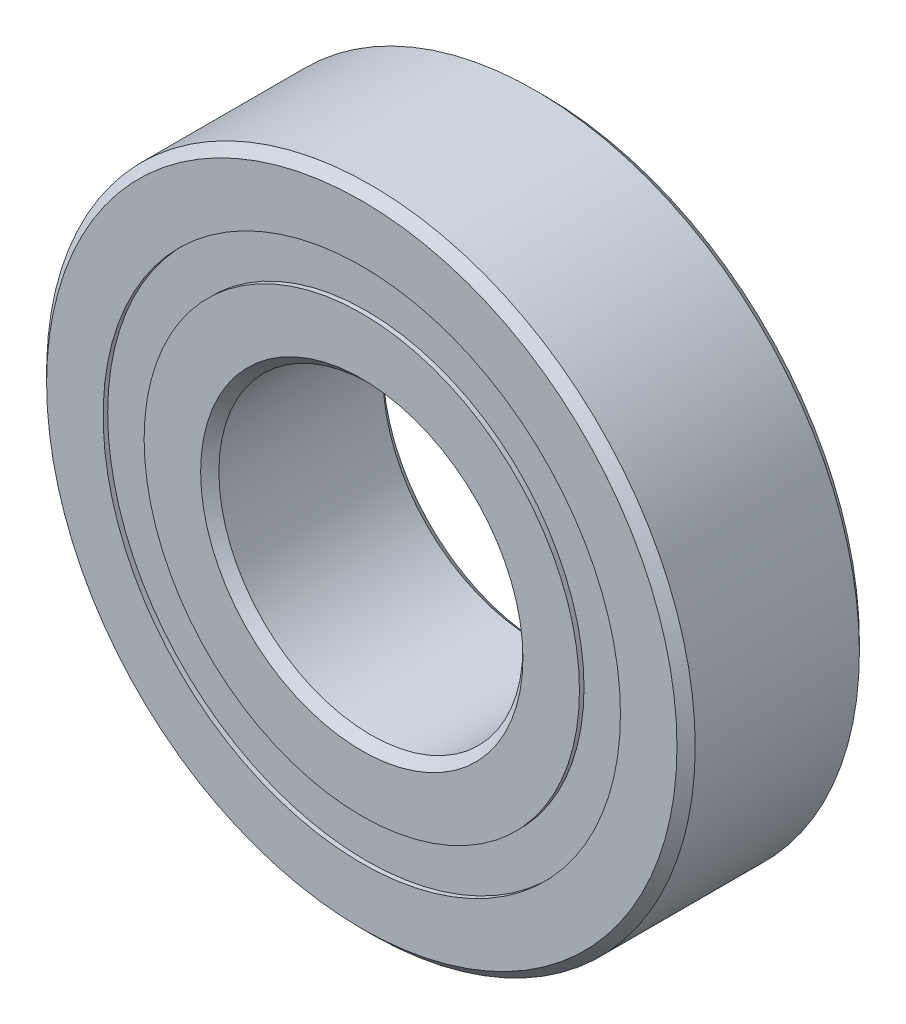
ISO-10303-21;
HEADER;
FILE_DESCRIPTION(('STEP AP214'),'2;1');
FILE_NAME('part.step','',(''),(''),'','','');
FILE_SCHEMA(('AUTOMOTIVE_DESIGN { 1 0 10303 214 1 1 1 1 }'));
ENDSEC;
DATA;
#1=APPLICATION_CONTEXT('core data for automotive mechanical design processes');
#2=APPLICATION_PROTOCOL_DEFINITION('international standard','automotive_design',2000,#1);
#3=PRODUCT_CONTEXT('',#1,'mechanical');
#4=PRODUCT('Part','Part','',(#3));
#5=PRODUCT_RELATED_PRODUCT_CATEGORY('part','',(#4));
#6=PRODUCT_DEFINITION_FORMATION('','',#4);
#7=PRODUCT_DEFINITION_CONTEXT('part definition',#1,'design');
#8=PRODUCT_DEFINITION('design','',#6,#7);
#9=PRODUCT_DEFINITION_SHAPE('','',#8);
#10=(LENGTH_UNIT() NAMED_UNIT(*) SI_UNIT(.MILLI.,.METRE.));
#11=(NAMED_UNIT(*) PLANE_ANGLE_UNIT() SI_UNIT($,.RADIAN.));
#12=(NAMED_UNIT(*) SI_UNIT($,.STERADIAN.) SOLID_ANGLE_UNIT());
#13=UNCERTAINTY_MEASURE_WITH_UNIT(LENGTH_MEASURE(1.E-05),#10,'distance_accuracy_value','');
#14=(GEOMETRIC_REPRESENTATION_CONTEXT(3) GLOBAL_UNCERTAINTY_ASSIGNED_CONTEXT((#13)) GLOBAL_UNIT_ASSIGNED_CONTEXT((#10,
#11,#12)) REPRESENTATION_CONTEXT('',''));
#15=CARTESIAN_POINT('',(0.,0.,0.));
#16=DIRECTION('',(0.,0.,1.));
#17=DIRECTION('',(1.,0.,0.));
#18=AXIS2_PLACEMENT_3D('',#15,#16,#17);
#19=CARTESIAN_POINT('',(-5.87499999999987,10.1757984944672,0.));
#20=DIRECTION('',(0.,0.,1.));
#21=DIRECTION('',(-0.499999999999989,0.866025403784445,0.));
#22=AXIS2_PLACEMENT_3D('',#19,#20,#21);
#23=SPHERICAL_SURFACE('',#22,2.2410039670515);
#24=CARTESIAN_POINT('',(-5.87499999999987,10.1757984944672,2.2410039670515));
#25=VERTEX_POINT('',#24);
#26=VERTEX_LOOP('',#25);
#27=FACE_BOUND('',#26,.T.);
#28=ADVANCED_FACE('F37',(#27),#23,.T.);
#29=CLOSED_SHELL('',(#28));
#30=MANIFOLD_SOLID_BREP('B2',#29);
#31=CARTESIAN_POINT('',(-10.1757984944671,5.87500000000012,0.));
#32=DIRECTION('',(0.,0.,1.));
#33=DIRECTION('',(-0.866025403784433,0.50000000000001,0.));
#34=AXIS2_PLACEMENT_3D('',#31,#32,#33);
#35=SPHERICAL_SURFACE('',#34,2.2410039670515);
#36=CARTESIAN_POINT('',(-10.1757984944671,5.87500000000012,2.2410039670515));
#37=VERTEX_POINT('',#36);
#38=VERTEX_LOOP('',#37);
#39=FACE_BOUND('',#38,.T.);
#40=ADVANCED_FACE('F57',(#39),#35,.T.);
#41=CLOSED_SHELL('',(#40));
#42=MANIFOLD_SOLID_BREP('B6',#41);
#43=CARTESIAN_POINT('',(-11.75,1.2307471719422E-13,0.));
#44=DIRECTION('',(0.,0.,1.));
#45=DIRECTION('',(-1.,0.,0.));
#46=AXIS2_PLACEMENT_3D('',#43,#44,#45);
#47=SPHERICAL_SURFACE('',#46,2.2410039670515);
#48=CARTESIAN_POINT('',(-11.75,1.2307471719422E-13,2.2410039670515));
#49=VERTEX_POINT('',#48);
#50=VERTEX_LOOP('',#49);
#51=FACE_BOUND('',#50,.T.);
#52=ADVANCED_FACE('F77',(#51),#47,.T.);
#53=CLOSED_SHELL('',(#52));
#54=MANIFOLD_SOLID_BREP('B33',#53);
#55=CARTESIAN_POINT('',(-10.1757984944672,-5.87499999999991,0.));
#56=DIRECTION('',(0.,0.,1.));
#57=DIRECTION('',(-0.866025403784443,-0.499999999999992,0.));
#58=AXIS2_PLACEMENT_3D('',#55,#56,#57);
#59=SPHERICAL_SURFACE('',#58,2.2410039670515);
#60=CARTESIAN_POINT('',(-10.1757984944672,-5.87499999999991,2.2410039670515));
#61=VERTEX_POINT('',#60);
#62=VERTEX_LOOP('',#61);
#63=FACE_BOUND('',#62,.T.);
#64=ADVANCED_FACE('F97',(#63),#59,.T.);
#65=CLOSED_SHELL('',(#64));
#66=MANIFOLD_SOLID_BREP('B53',#65);
#67=CARTESIAN_POINT('',(-5.87500000000009,-10.1757984944671,0.));
#68=DIRECTION('',(0.,0.,1.));
#69=DIRECTION('',(-0.500000000000007,-0.866025403784435,0.));
#70=AXIS2_PLACEMENT_3D('',#67,#68,#69);
#71=SPHERICAL_SURFACE('',#70,2.2410039670515);
#72=CARTESIAN_POINT('',(-5.87500000000009,-10.1757984944671,2.2410039670515));
#73=VERTEX_POINT('',#72);
#74=VERTEX_LOOP('',#73);
#75=FACE_BOUND('',#74,.T.);
#76=ADVANCED_FACE('F117',(#75),#71,.T.);
#77=CLOSED_SHELL('',(#76));
#78=MANIFOLD_SOLID_BREP('B73',#77);
#79=CARTESIAN_POINT('',(0.,-11.75,0.));
#80=DIRECTION('',(0.,0.,1.));
#81=DIRECTION('',(0.,-1.,0.));
#82=AXIS2_PLACEMENT_3D('',#79,#80,#81);
#83=SPHERICAL_SURFACE('',#82,2.2410039670515);
#84=CARTESIAN_POINT('',(0.,-11.75,2.2410039670515));
#85=VERTEX_POINT('',#84);
#86=VERTEX_LOOP('',#85);
#87=FACE_BOUND('',#86,.T.);
#88=ADVANCED_FACE('F137',(#87),#83,.T.);
#89=CLOSED_SHELL('',(#88));
#90=MANIFOLD_SOLID_BREP('B93',#89);
#91=CARTESIAN_POINT('',(5.87499999999994,-10.1757984944672,0.));
#92=DIRECTION('',(0.,0.,1.));
#93=DIRECTION('',(0.499999999999995,-0.866025403784442,0.));
#94=AXIS2_PLACEMENT_3D('',#91,#92,#93);
#95=SPHERICAL_SURFACE('',#94,2.2410039670515);
#96=CARTESIAN_POINT('',(5.87499999999994,-10.1757984944672,2.2410039670515));
#97=VERTEX_POINT('',#96);
#98=VERTEX_LOOP('',#97);
#99=FACE_BOUND('',#98,.T.);
#100=ADVANCED_FACE('F157',(#99),#95,.T.);
#101=CLOSED_SHELL('',(#100));
#102=MANIFOLD_SOLID_BREP('B113',#101);
#103=CARTESIAN_POINT('',(10.1757984944671,-5.87500000000005,0.));
#104=DIRECTION('',(0.,0.,1.));
#105=DIRECTION('',(0.866025403784436,-0.500000000000004,0.));
#106=AXIS2_PLACEMENT_3D('',#103,#104,#105);
#107=SPHERICAL_SURFACE('',#106,2.2410039670515);
#108=CARTESIAN_POINT('',(10.1757984944671,-5.87500000000005,2.2410039670515));
#109=VERTEX_POINT('',#108);
#110=VERTEX_LOOP('',#109);
#111=FACE_BOUND('',#110,.T.);
#112=ADVANCED_FACE('F177',(#111),#107,.T.);
#113=CLOSED_SHELL('',(#112));
#114=MANIFOLD_SOLID_BREP('B133',#113);
#115=CARTESIAN_POINT('',(11.75,0.,0.));
#116=DIRECTION('',(0.,0.,1.));
#117=DIRECTION('',(1.,0.,0.));
#118=AXIS2_PLACEMENT_3D('',#115,#116,#117);
#119=SPHERICAL_SURFACE('',#118,2.2410039670515);
#120=CARTESIAN_POINT('',(11.75,0.,2.2410039670515));
#121=VERTEX_POINT('',#120);
#122=VERTEX_LOOP('',#121);
#123=FACE_BOUND('',#122,.T.);
#124=ADVANCED_FACE('F197',(#123),#119,.T.);
#125=CLOSED_SHELL('',(#124));
#126=MANIFOLD_SOLID_BREP('B153',#125);
#127=CARTESIAN_POINT('',(10.1757984944672,5.87499999999998,0.));
#128=DIRECTION('',(0.,0.,1.));
#129=DIRECTION('',(0.86602540378444,0.499999999999998,0.));
#130=AXIS2_PLACEMENT_3D('',#127,#128,#129);
#131=SPHERICAL_SURFACE('',#130,2.2410039670515);
#132=CARTESIAN_POINT('',(10.1757984944672,5.87499999999998,2.2410039670515));
#133=VERTEX_POINT('',#132);
#134=VERTEX_LOOP('',#133);
#135=FACE_BOUND('',#134,.T.);
#136=ADVANCED_FACE('F217',(#135),#131,.T.);
#137=CLOSED_SHELL('',(#136));
#138=MANIFOLD_SOLID_BREP('B173',#137);
#139=CARTESIAN_POINT('',(5.87500000000001,10.1757984944671,0.));
#140=DIRECTION('',(0.,0.,1.));
#141=DIRECTION('',(0.500000000000001,0.866025403784438,0.));
#142=AXIS2_PLACEMENT_3D('',#139,#140,#141);
#143=SPHERICAL_SURFACE('',#142,2.2410039670515);
#144=CARTESIAN_POINT('',(5.87500000000001,10.1757984944671,2.2410039670515));
#145=VERTEX_POINT('',#144);
#146=VERTEX_LOOP('',#145);
#147=FACE_BOUND('',#146,.T.);
#148=ADVANCED_FACE('F237',(#147),#143,.T.);
#149=CLOSED_SHELL('',(#148));
#150=MANIFOLD_SOLID_BREP('B193',#149);
#151=CARTESIAN_POINT('',(0.,11.75,0.));
#152=DIRECTION('',(0.,0.,1.));
#153=DIRECTION('',(0.,1.,0.));
#154=AXIS2_PLACEMENT_3D('',#151,#152,#153);
#155=SPHERICAL_SURFACE('',#154,2.2410039670515);
#156=CARTESIAN_POINT('',(0.,11.75,2.2410039670515));
#157=VERTEX_POINT('',#156);
#158=VERTEX_LOOP('',#157);
#159=FACE_BOUND('',#158,.T.);
#160=ADVANCED_FACE('F258',(#159),#155,.T.);
#161=CLOSED_SHELL('',(#160));
#162=MANIFOLD_SOLID_BREP('B213',#161);
#163=CARTESIAN_POINT('',(0.,0.,4.5));
#164=DIRECTION('',(0.,0.,1.));
#165=DIRECTION('',(1.,0.,0.));
#166=AXIS2_PLACEMENT_3D('',#163,#164,#165);
#167=CYLINDRICAL_SURFACE('',#166,12.760989010989);
#168=CARTESIAN_POINT('',(0.,0.,-4.5));
#169=DIRECTION('',(0.,0.,1.));
#170=DIRECTION('',(1.,0.,0.));
#171=AXIS2_PLACEMENT_3D('',#168,#169,#170);
#172=CIRCLE('',#171,12.760989010989);
#173=CARTESIAN_POINT('',(12.760989010989,0.,-4.5));
#174=VERTEX_POINT('',#173);
#175=EDGE_CURVE('E310',#174,#174,#172,.T.);
#176=ORIENTED_EDGE('',*,*,#175,.F.);
#177=EDGE_LOOP('',(#176));
#178=FACE_BOUND('',#177,.T.);
#179=CARTESIAN_POINT('',(0.,0.,-4.275));
#180=DIRECTION('',(0.,0.,1.));
#181=DIRECTION('',(1.,0.,0.));
#182=AXIS2_PLACEMENT_3D('',#179,#180,#181);
#183=CIRCLE('',#182,12.760989010989);
#184=CARTESIAN_POINT('',(12.760989010989,0.,-4.275));
#185=VERTEX_POINT('',#184);
#186=EDGE_CURVE('E257',#185,#185,#183,.F.);
#187=ORIENTED_EDGE('',*,*,#186,.F.);
#188=EDGE_LOOP('',(#187));
#189=FACE_BOUND('',#188,.T.);
#190=ADVANCED_FACE('F271',(#178,#189),#167,.F.);
#191=CARTESIAN_POINT('',(0.,0.,4.5));
#192=DIRECTION('',(0.,0.,1.));
#193=DIRECTION('',(1.,0.,0.));
#194=AXIS2_PLACEMENT_3D('',#191,#192,#193);
#195=CYLINDRICAL_SURFACE('',#194,10.739010989011);
#196=CARTESIAN_POINT('',(0.,0.,-4.5));
#197=DIRECTION('',(0.,0.,1.));
#198=DIRECTION('',(1.,0.,0.));
#199=AXIS2_PLACEMENT_3D('',#196,#197,#198);
#200=CIRCLE('',#199,10.739010989011);
#201=CARTESIAN_POINT('',(10.739010989011,0.,-4.5));
#202=VERTEX_POINT('',#201);
#203=EDGE_CURVE('E337',#202,#202,#200,.T.);
#204=ORIENTED_EDGE('',*,*,#203,.T.);
#205=EDGE_LOOP('',(#204));
#206=FACE_BOUND('',#205,.T.);
#207=CARTESIAN_POINT('',(0.,0.,-4.275));
#208=DIRECTION('',(0.,0.,1.));
#209=DIRECTION('',(1.,0.,0.));
#210=AXIS2_PLACEMENT_3D('',#207,#208,#209);
#211=CIRCLE('',#210,10.739010989011);
#212=CARTESIAN_POINT('',(10.739010989011,0.,-4.275));
#213=VERTEX_POINT('',#212);
#214=EDGE_CURVE('E283',#213,#213,#211,.T.);
#215=ORIENTED_EDGE('',*,*,#214,.F.);
#216=EDGE_LOOP('',(#215));
#217=FACE_BOUND('',#216,.T.);
#218=ADVANCED_FACE('F379',(#206,#217),#195,.T.);
#219=CARTESIAN_POINT('',(0.,0.,4.5));
#220=DIRECTION('',(0.,0.,1.));
#221=DIRECTION('',(1.,0.,0.));
#222=AXIS2_PLACEMENT_3D('',#219,#220,#221);
#223=CYLINDRICAL_SURFACE('',#222,12.760989010989);
#224=CARTESIAN_POINT('',(0.,0.,4.5));
#225=DIRECTION('',(0.,0.,1.));
#226=DIRECTION('',(1.,0.,0.));
#227=AXIS2_PLACEMENT_3D('',#224,#225,#226);
#228=CIRCLE('',#227,12.760989010989);
#229=CARTESIAN_POINT('',(12.760989010989,0.,4.5));
#230=VERTEX_POINT('',#229);
#231=EDGE_CURVE('E301',#230,#230,#228,.T.);
#232=ORIENTED_EDGE('',*,*,#231,.T.);
#233=EDGE_LOOP('',(#232));
#234=FACE_BOUND('',#233,.T.);
#235=CARTESIAN_POINT('',(0.,0.,4.275));
#236=DIRECTION('',(0.,0.,-1.));
#237=DIRECTION('',(-1.,0.,0.));
#238=AXIS2_PLACEMENT_3D('',#235,#236,#237);
#239=CIRCLE('',#238,12.760989010989);
#240=CARTESIAN_POINT('',(-12.760989010989,0.,4.275));
#241=VERTEX_POINT('',#240);
#242=EDGE_CURVE('E292',#241,#241,#239,.F.);
#243=ORIENTED_EDGE('',*,*,#242,.F.);
#244=EDGE_LOOP('',(#243));
#245=FACE_BOUND('',#244,.T.);
#246=ADVANCED_FACE('F377',(#234,#245),#223,.F.);
#247=CARTESIAN_POINT('',(0.,0.,4.05));
#248=DIRECTION('',(0.,0.,-1.));
#249=DIRECTION('',(-1.,0.,0.));
#250=AXIS2_PLACEMENT_3D('',#247,#248,#249);
#251=CONICAL_SURFACE('',#250,16.,0.785398163397451);
#252=CARTESIAN_POINT('',(0.,0.,4.5));
#253=DIRECTION('',(0.,0.,1.));
#254=DIRECTION('',(1.,0.,0.));
#255=AXIS2_PLACEMENT_3D('',#252,#253,#254);
#256=CIRCLE('',#255,15.55);
#257=CARTESIAN_POINT('',(15.55,0.,4.5));
#258=VERTEX_POINT('',#257);
#259=EDGE_CURVE('E298',#258,#258,#256,.T.);
#260=ORIENTED_EDGE('',*,*,#259,.F.);
#261=EDGE_LOOP('',(#260));
#262=FACE_BOUND('',#261,.T.);
#263=CARTESIAN_POINT('',(0.,0.,4.05));
#264=DIRECTION('',(0.,0.,1.));
#265=DIRECTION('',(1.,0.,0.));
#266=AXIS2_PLACEMENT_3D('',#263,#264,#265);
#267=CIRCLE('',#266,16.);
#268=CARTESIAN_POINT('',(16.,0.,4.05));
#269=VERTEX_POINT('',#268);
#270=EDGE_CURVE('E319',#269,#269,#267,.T.);
#271=ORIENTED_EDGE('',*,*,#270,.T.);
#272=EDGE_LOOP('',(#271));
#273=FACE_BOUND('',#272,.T.);
#274=ADVANCED_FACE('F273',(#262,#273),#251,.T.);
#275=CARTESIAN_POINT('',(0.,15.55,4.5));
#276=DIRECTION('',(0.,0.,-1.));
#277=DIRECTION('',(-1.,0.,0.));
#278=AXIS2_PLACEMENT_3D('',#275,#276,#277);
#279=PLANE('',#278);
#280=ORIENTED_EDGE('',*,*,#231,.F.);
#281=EDGE_LOOP('',(#280));
#282=FACE_BOUND('',#281,.T.);
#283=ORIENTED_EDGE('',*,*,#259,.T.);
#284=EDGE_LOOP('',(#283));
#285=FACE_BOUND('',#284,.T.);
#286=ADVANCED_FACE('F387',(#282,#285),#279,.F.);
#287=CARTESIAN_POINT('',(0.,15.55,-4.5));
#288=DIRECTION('',(0.,0.,1.));
#289=DIRECTION('',(1.,0.,0.));
#290=AXIS2_PLACEMENT_3D('',#287,#288,#289);
#291=PLANE('',#290);
#292=CARTESIAN_POINT('',(0.,0.,-4.5));
#293=DIRECTION('',(0.,0.,1.));
#294=DIRECTION('',(1.,0.,0.));
#295=AXIS2_PLACEMENT_3D('',#292,#293,#294);
#296=CIRCLE('',#295,15.55);
#297=CARTESIAN_POINT('',(15.55,0.,-4.5));
#298=VERTEX_POINT('',#297);
#299=EDGE_CURVE('E313',#298,#298,#296,.T.);
#300=ORIENTED_EDGE('',*,*,#299,.F.);
#301=EDGE_LOOP('',(#300));
#302=FACE_BOUND('',#301,.T.);
#303=ORIENTED_EDGE('',*,*,#175,.T.);
#304=EDGE_LOOP('',(#303));
#305=FACE_BOUND('',#304,.T.);
#306=ADVANCED_FACE('F449',(#302,#305),#291,.F.);
#307=CARTESIAN_POINT('',(0.,0.,-4.5));
#308=DIRECTION('',(0.,0.,1.));
#309=DIRECTION('',(1.,0.,0.));
#310=AXIS2_PLACEMENT_3D('',#307,#308,#309);
#311=CONICAL_SURFACE('',#310,15.55,0.785398163397452);
#312=CARTESIAN_POINT('',(0.,0.,-4.05));
#313=DIRECTION('',(0.,0.,1.));
#314=DIRECTION('',(1.,0.,0.));
#315=AXIS2_PLACEMENT_3D('',#312,#313,#314);
#316=CIRCLE('',#315,16.);
#317=CARTESIAN_POINT('',(16.,0.,-4.05));
#318=VERTEX_POINT('',#317);
#319=EDGE_CURVE('E316',#318,#318,#316,.T.);
#320=ORIENTED_EDGE('',*,*,#319,.F.);
#321=EDGE_LOOP('',(#320));
#322=FACE_BOUND('',#321,.T.);
#323=ORIENTED_EDGE('',*,*,#299,.T.);
#324=EDGE_LOOP('',(#323));
#325=FACE_BOUND('',#324,.T.);
#326=ADVANCED_FACE('F446',(#322,#325),#311,.T.);
#327=CARTESIAN_POINT('',(0.,0.,4.5));
#328=DIRECTION('',(0.,0.,1.));
#329=DIRECTION('',(1.,0.,0.));
#330=AXIS2_PLACEMENT_3D('',#327,#328,#329);
#331=CYLINDRICAL_SURFACE('',#330,16.);
#332=ORIENTED_EDGE('',*,*,#270,.F.);
#333=EDGE_LOOP('',(#332));
#334=FACE_BOUND('',#333,.T.);
#335=ORIENTED_EDGE('',*,*,#319,.T.);
#336=EDGE_LOOP('',(#335));
#337=FACE_BOUND('',#336,.T.);
#338=ADVANCED_FACE('F373',(#334,#337),#331,.T.);
#339=CARTESIAN_POINT('',(0.,12.760989010989,4.275));
#340=DIRECTION('',(0.,0.,-1.));
#341=DIRECTION('',(-1.,0.,0.));
#342=AXIS2_PLACEMENT_3D('',#339,#340,#341);
#343=PLANE('',#342);
#344=CARTESIAN_POINT('',(0.,0.,4.275));
#345=DIRECTION('',(0.,0.,1.));
#346=DIRECTION('',(1.,0.,0.));
#347=AXIS2_PLACEMENT_3D('',#344,#345,#346);
#348=CIRCLE('',#347,10.739010989011);
#349=CARTESIAN_POINT('',(10.739010989011,0.,4.275));
#350=VERTEX_POINT('',#349);
#351=EDGE_CURVE('E322',#350,#350,#348,.T.);
#352=ORIENTED_EDGE('',*,*,#351,.F.);
#353=EDGE_LOOP('',(#352));
#354=FACE_BOUND('',#353,.T.);
#355=ORIENTED_EDGE('',*,*,#242,.T.);
#356=EDGE_LOOP('',(#355));
#357=FACE_BOUND('',#356,.T.);
#358=ADVANCED_FACE('F366',(#354,#357),#343,.F.);
#359=CARTESIAN_POINT('',(0.,0.,4.5));
#360=DIRECTION('',(0.,0.,1.));
#361=DIRECTION('',(1.,0.,0.));
#362=AXIS2_PLACEMENT_3D('',#359,#360,#361);
#363=CYLINDRICAL_SURFACE('',#362,10.739010989011);
#364=CARTESIAN_POINT('',(0.,0.,4.5));
#365=DIRECTION('',(0.,0.,1.));
#366=DIRECTION('',(1.,0.,0.));
#367=AXIS2_PLACEMENT_3D('',#364,#365,#366);
#368=CIRCLE('',#367,10.739010989011);
#369=CARTESIAN_POINT('',(10.739010989011,0.,4.5));
#370=VERTEX_POINT('',#369);
#371=EDGE_CURVE('E346',#370,#370,#368,.T.);
#372=ORIENTED_EDGE('',*,*,#371,.F.);
#373=EDGE_LOOP('',(#372));
#374=FACE_BOUND('',#373,.T.);
#375=ORIENTED_EDGE('',*,*,#351,.T.);
#376=EDGE_LOOP('',(#375));
#377=FACE_BOUND('',#376,.T.);
#378=ADVANCED_FACE('F363',(#374,#377),#363,.T.);
#379=CARTESIAN_POINT('',(0.,0.,4.5));
#380=DIRECTION('',(0.,0.,1.));
#381=DIRECTION('',(1.,0.,0.));
#382=AXIS2_PLACEMENT_3D('',#379,#380,#381);
#383=CONICAL_SURFACE('',#382,7.95000000000001,0.785398163397455);
#384=CARTESIAN_POINT('',(0.,0.,4.05));
#385=DIRECTION('',(0.,0.,1.));
#386=DIRECTION('',(1.,0.,0.));
#387=AXIS2_PLACEMENT_3D('',#384,#385,#386);
#388=CIRCLE('',#387,7.50000000000001);
#389=CARTESIAN_POINT('',(7.50000000000001,0.,4.05));
#390=VERTEX_POINT('',#389);
#391=EDGE_CURVE('E328',#390,#390,#388,.T.);
#392=ORIENTED_EDGE('',*,*,#391,.F.);
#393=EDGE_LOOP('',(#392));
#394=FACE_BOUND('',#393,.T.);
#395=CARTESIAN_POINT('',(0.,0.,4.5));
#396=DIRECTION('',(0.,0.,1.));
#397=DIRECTION('',(1.,0.,0.));
#398=AXIS2_PLACEMENT_3D('',#395,#396,#397);
#399=CIRCLE('',#398,7.95000000000001);
#400=CARTESIAN_POINT('',(7.95000000000001,0.,4.5));
#401=VERTEX_POINT('',#400);
#402=EDGE_CURVE('E349',#401,#401,#399,.T.);
#403=ORIENTED_EDGE('',*,*,#402,.T.);
#404=EDGE_LOOP('',(#403));
#405=FACE_BOUND('',#404,.T.);
#406=ADVANCED_FACE('F353',(#394,#405),#383,.F.);
#407=CARTESIAN_POINT('',(0.,0.,4.5));
#408=DIRECTION('',(0.,0.,1.));
#409=DIRECTION('',(1.,0.,0.));
#410=AXIS2_PLACEMENT_3D('',#407,#408,#409);
#411=CYLINDRICAL_SURFACE('',#410,7.50000000000001);
#412=CARTESIAN_POINT('',(0.,0.,-4.05));
#413=DIRECTION('',(0.,0.,1.));
#414=DIRECTION('',(1.,0.,0.));
#415=AXIS2_PLACEMENT_3D('',#412,#413,#414);
#416=CIRCLE('',#415,7.50000000000001);
#417=CARTESIAN_POINT('',(7.50000000000001,0.,-4.05));
#418=VERTEX_POINT('',#417);
#419=EDGE_CURVE('E331',#418,#418,#416,.T.);
#420=ORIENTED_EDGE('',*,*,#419,.F.);
#421=EDGE_LOOP('',(#420));
#422=FACE_BOUND('',#421,.T.);
#423=ORIENTED_EDGE('',*,*,#391,.T.);
#424=EDGE_LOOP('',(#423));
#425=FACE_BOUND('',#424,.T.);
#426=ADVANCED_FACE('F436',(#422,#425),#411,.F.);
#427=CARTESIAN_POINT('',(0.,0.,-4.05));
#428=DIRECTION('',(0.,0.,-1.));
#429=DIRECTION('',(-1.,0.,0.));
#430=AXIS2_PLACEMENT_3D('',#427,#428,#429);
#431=CONICAL_SURFACE('',#430,7.50000000000001,0.785398163397456);
#432=CARTESIAN_POINT('',(0.,0.,-4.5));
#433=DIRECTION('',(0.,0.,1.));
#434=DIRECTION('',(1.,0.,0.));
#435=AXIS2_PLACEMENT_3D('',#432,#433,#434);
#436=CIRCLE('',#435,7.95000000000001);
#437=CARTESIAN_POINT('',(7.95000000000001,0.,-4.5));
#438=VERTEX_POINT('',#437);
#439=EDGE_CURVE('E334',#438,#438,#436,.T.);
#440=ORIENTED_EDGE('',*,*,#439,.F.);
#441=EDGE_LOOP('',(#440));
#442=FACE_BOUND('',#441,.T.);
#443=ORIENTED_EDGE('',*,*,#419,.T.);
#444=EDGE_LOOP('',(#443));
#445=FACE_BOUND('',#444,.T.);
#446=ADVANCED_FACE('F432',(#442,#445),#431,.F.);
#447=CARTESIAN_POINT('',(0.,7.95000000000001,-4.5));
#448=DIRECTION('',(0.,0.,1.));
#449=DIRECTION('',(1.,0.,0.));
#450=AXIS2_PLACEMENT_3D('',#447,#448,#449);
#451=PLANE('',#450);
#452=ORIENTED_EDGE('',*,*,#203,.F.);
#453=EDGE_LOOP('',(#452));
#454=FACE_BOUND('',#453,.T.);
#455=ORIENTED_EDGE('',*,*,#439,.T.);
#456=EDGE_LOOP('',(#455));
#457=FACE_BOUND('',#456,.T.);
#458=ADVANCED_FACE('F359',(#454,#457),#451,.F.);
#459=CARTESIAN_POINT('',(0.,7.95000000000001,4.5));
#460=DIRECTION('',(0.,0.,-1.));
#461=DIRECTION('',(-1.,0.,0.));
#462=AXIS2_PLACEMENT_3D('',#459,#460,#461);
#463=PLANE('',#462);
#464=ORIENTED_EDGE('',*,*,#402,.F.);
#465=EDGE_LOOP('',(#464));
#466=FACE_BOUND('',#465,.T.);
#467=ORIENTED_EDGE('',*,*,#371,.T.);
#468=EDGE_LOOP('',(#467));
#469=FACE_BOUND('',#468,.T.);
#470=ADVANCED_FACE('F355',(#466,#469),#463,.F.);
#471=CARTESIAN_POINT('',(0.,12.760989010989,-4.275));
#472=DIRECTION('',(0.,0.,1.));
#473=DIRECTION('',(1.,0.,0.));
#474=AXIS2_PLACEMENT_3D('',#471,#472,#473);
#475=PLANE('',#474);
#476=ORIENTED_EDGE('',*,*,#186,.T.);
#477=EDGE_LOOP('',(#476));
#478=FACE_BOUND('',#477,.T.);
#479=ORIENTED_EDGE('',*,*,#214,.T.);
#480=EDGE_LOOP('',(#479));
#481=FACE_BOUND('',#480,.T.);
#482=ADVANCED_FACE('F358',(#478,#481),#475,.F.);
#483=CLOSED_SHELL('',(#190,#218,#246,#274,#286,#306,#326,#338,#358,#378,#406,#426,#446,#458,
#470,#482));
#484=CARTESIAN_POINT('',(0.,12.760989010989,-2.2410039670515));
#485=DIRECTION('',(0.,0.,-1.));
#486=DIRECTION('',(-1.,0.,0.));
#487=AXIS2_PLACEMENT_3D('',#484,#485,#486);
#488=PLANE('',#487);
#489=CARTESIAN_POINT('',(0.,0.,-2.2410039670515));
#490=DIRECTION('',(0.,0.,-1.));
#491=DIRECTION('',(-1.,0.,0.));
#492=AXIS2_PLACEMENT_3D('',#489,#490,#491);
#493=CIRCLE('',#492,10.739010989011);
#494=CARTESIAN_POINT('',(-10.739010989011,0.,-2.2410039670515));
#495=VERTEX_POINT('',#494);
#496=EDGE_CURVE('E287',#495,#495,#493,.T.);
#497=ORIENTED_EDGE('',*,*,#496,.T.);
#498=EDGE_LOOP('',(#497));
#499=FACE_BOUND('',#498,.T.);
#500=CARTESIAN_POINT('',(0.,0.,-2.2410039670515));
#501=DIRECTION('',(0.,0.,-1.));
#502=DIRECTION('',(-1.,0.,0.));
#503=AXIS2_PLACEMENT_3D('',#500,#501,#502);
#504=CIRCLE('',#503,12.760989010989);
#505=CARTESIAN_POINT('',(-12.760989010989,0.,-2.2410039670515));
#506=VERTEX_POINT('',#505);
#507=EDGE_CURVE('E279',#506,#506,#504,.F.);
#508=ORIENTED_EDGE('',*,*,#507,.T.);
#509=EDGE_LOOP('',(#508));
#510=FACE_BOUND('',#509,.T.);
#511=ADVANCED_FACE('F395',(#499,#510),#488,.F.);
#512=CARTESIAN_POINT('',(0.,0.,2.));
#513=DIRECTION('',(0.,0.,1.));
#514=DIRECTION('',(1.,0.,0.));
#515=AXIS2_PLACEMENT_3D('',#512,#513,#514);
#516=CIRCLE('',#515,12.760989010989);
#517=CARTESIAN_POINT('',(12.760989010989,0.,2.));
#518=VERTEX_POINT('',#517);
#519=EDGE_CURVE('E304',#518,#518,#516,.T.);
#520=ORIENTED_EDGE('',*,*,#519,.F.);
#521=EDGE_LOOP('',(#520));
#522=FACE_BOUND('',#521,.T.);
#523=CARTESIAN_POINT('',(0.,0.,2.2410039670515));
#524=DIRECTION('',(0.,0.,1.));
#525=DIRECTION('',(1.,0.,0.));
#526=AXIS2_PLACEMENT_3D('',#523,#524,#525);
#527=CIRCLE('',#526,12.760989010989);
#528=CARTESIAN_POINT('',(12.760989010989,0.,2.2410039670515));
#529=VERTEX_POINT('',#528);
#530=EDGE_CURVE('E295',#529,#529,#527,.F.);
#531=ORIENTED_EDGE('',*,*,#530,.F.);
#532=EDGE_LOOP('',(#531));
#533=FACE_BOUND('',#532,.T.);
#534=ADVANCED_FACE('F382',(#522,#533),#223,.F.);
#535=CARTESIAN_POINT('',(0.,0.,0.));
#536=DIRECTION('',(0.,0.,1.));
#537=DIRECTION('',(1.,0.,0.));
#538=AXIS2_PLACEMENT_3D('',#535,#536,#537);
#539=TOROIDAL_SURFACE('',#538,11.75,2.2410039670515);
#540=CARTESIAN_POINT('',(0.,0.,-2.));
#541=DIRECTION('',(0.,0.,1.));
#542=DIRECTION('',(1.,0.,0.));
#543=AXIS2_PLACEMENT_3D('',#540,#541,#542);
#544=CIRCLE('',#543,12.760989010989);
#545=CARTESIAN_POINT('',(12.760989010989,0.,-2.));
#546=VERTEX_POINT('',#545);
#547=EDGE_CURVE('E307',#546,#546,#544,.T.);
#548=ORIENTED_EDGE('',*,*,#547,.F.);
#549=EDGE_LOOP('',(#548));
#550=FACE_BOUND('',#549,.T.);
#551=ORIENTED_EDGE('',*,*,#519,.T.);
#552=EDGE_LOOP('',(#551));
#553=FACE_BOUND('',#552,.T.);
#554=ADVANCED_FACE('F394',(#550,#553),#539,.F.);
#555=ORIENTED_EDGE('',*,*,#547,.T.);
#556=EDGE_LOOP('',(#555));
#557=FACE_BOUND('',#556,.T.);
#558=ORIENTED_EDGE('',*,*,#507,.F.);
#559=EDGE_LOOP('',(#558));
#560=FACE_BOUND('',#559,.T.);
#561=ADVANCED_FACE('F401',(#557,#560),#167,.F.);
#562=CARTESIAN_POINT('',(0.,12.760989010989,2.2410039670515));
#563=DIRECTION('',(0.,0.,1.));
#564=DIRECTION('',(1.,0.,0.));
#565=AXIS2_PLACEMENT_3D('',#562,#563,#564);
#566=PLANE('',#565);
#567=ORIENTED_EDGE('',*,*,#530,.T.);
#568=EDGE_LOOP('',(#567));
#569=FACE_BOUND('',#568,.T.);
#570=CARTESIAN_POINT('',(0.,0.,2.2410039670515));
#571=DIRECTION('',(0.,0.,1.));
#572=DIRECTION('',(1.,0.,0.));
#573=AXIS2_PLACEMENT_3D('',#570,#571,#572);
#574=CIRCLE('',#573,10.739010989011);
#575=CARTESIAN_POINT('',(10.739010989011,0.,2.2410039670515));
#576=VERTEX_POINT('',#575);
#577=EDGE_CURVE('E325',#576,#576,#574,.F.);
#578=ORIENTED_EDGE('',*,*,#577,.F.);
#579=EDGE_LOOP('',(#578));
#580=FACE_BOUND('',#579,.T.);
#581=ADVANCED_FACE('F408',(#569,#580),#566,.F.);
#582=CARTESIAN_POINT('',(0.,0.,2.));
#583=DIRECTION('',(0.,0.,1.));
#584=DIRECTION('',(1.,0.,0.));
#585=AXIS2_PLACEMENT_3D('',#582,#583,#584);
#586=CIRCLE('',#585,10.739010989011);
#587=CARTESIAN_POINT('',(10.739010989011,0.,2.));
#588=VERTEX_POINT('',#587);
#589=EDGE_CURVE('E343',#588,#588,#586,.T.);
#590=ORIENTED_EDGE('',*,*,#589,.T.);
#591=EDGE_LOOP('',(#590));
#592=FACE_BOUND('',#591,.T.);
#593=ORIENTED_EDGE('',*,*,#577,.T.);
#594=EDGE_LOOP('',(#593));
#595=FACE_BOUND('',#594,.T.);
#596=ADVANCED_FACE('F368',(#592,#595),#363,.T.);
#597=CARTESIAN_POINT('',(0.,0.,0.));
#598=DIRECTION('',(0.,0.,1.));
#599=DIRECTION('',(1.,0.,0.));
#600=AXIS2_PLACEMENT_3D('',#597,#598,#599);
#601=TOROIDAL_SURFACE('',#600,11.75,2.2410039670515);
#602=ORIENTED_EDGE('',*,*,#589,.F.);
#603=EDGE_LOOP('',(#602));
#604=FACE_BOUND('',#603,.T.);
#605=CARTESIAN_POINT('',(0.,0.,-2.));
#606=DIRECTION('',(0.,0.,1.));
#607=DIRECTION('',(1.,0.,0.));
#608=AXIS2_PLACEMENT_3D('',#605,#606,#607);
#609=CIRCLE('',#608,10.739010989011);
#610=CARTESIAN_POINT('',(10.739010989011,0.,-2.));
#611=VERTEX_POINT('',#610);
#612=EDGE_CURVE('E340',#611,#611,#609,.T.);
#613=ORIENTED_EDGE('',*,*,#612,.T.);
#614=EDGE_LOOP('',(#613));
#615=FACE_BOUND('',#614,.T.);
#616=ADVANCED_FACE('F426',(#604,#615),#601,.F.);
#617=ORIENTED_EDGE('',*,*,#612,.F.);
#618=EDGE_LOOP('',(#617));
#619=FACE_BOUND('',#618,.T.);
#620=ORIENTED_EDGE('',*,*,#496,.F.);
#621=EDGE_LOOP('',(#620));
#622=FACE_BOUND('',#621,.T.);
#623=ADVANCED_FACE('F391',(#619,#622),#195,.T.);
#624=CLOSED_SHELL('',(#511,#534,#554,#561,#581,#596,#616,#623));
#625=ORIENTED_CLOSED_SHELL('',*,#624,.T.);
#626=BREP_WITH_VOIDS('B233',#483,(#625));
#627=ADVANCED_BREP_SHAPE_REPRESENTATION('',(#18,#30,#42,#54,#66,#78,#90,#102,#114,#126,#138,
#150,#162,#626),#14);
#628=SHAPE_DEFINITION_REPRESENTATION(#9,#627);
ENDSEC;
END-ISO-10303-21;
